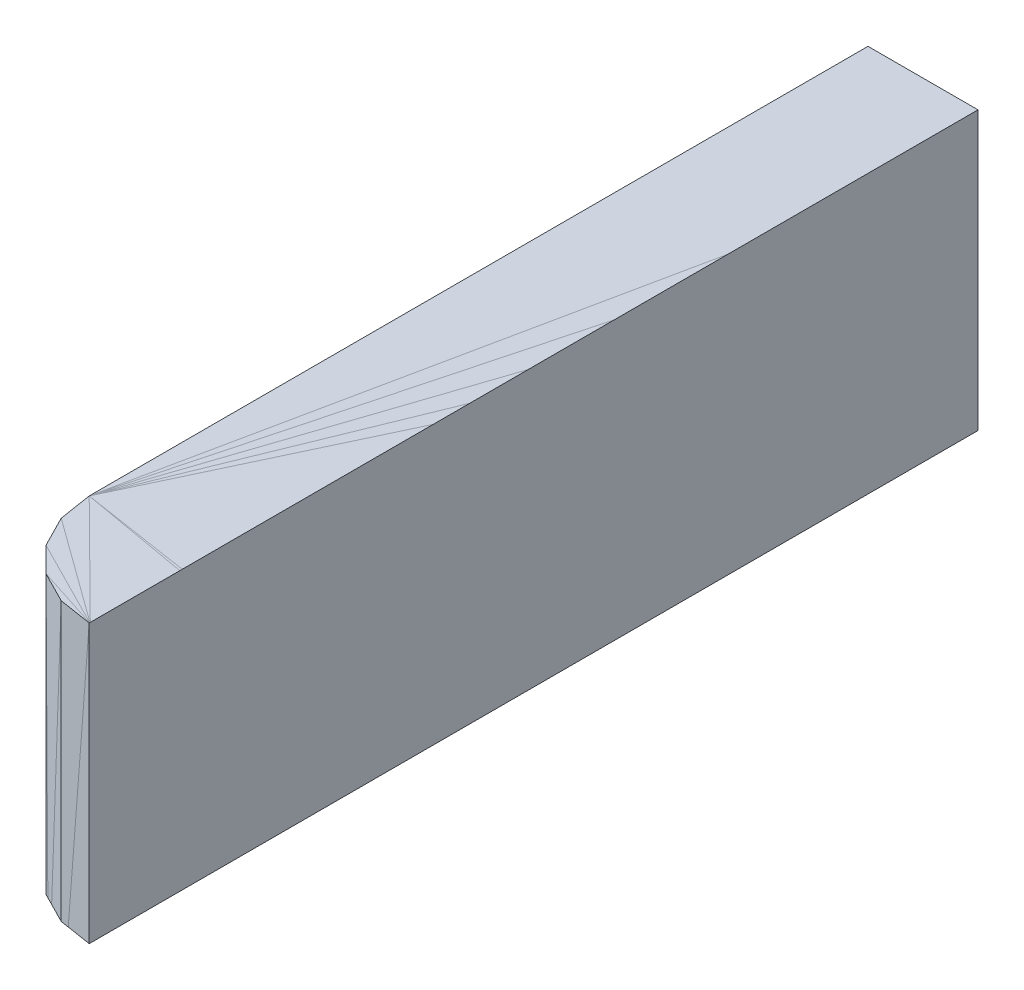
ISO-10303-21;
HEADER;
FILE_DESCRIPTION(('STEP AP214'),'2;1');
FILE_NAME('part.step','',(''),(''),'','','');
FILE_SCHEMA(('AUTOMOTIVE_DESIGN { 1 0 10303 214 1 1 1 1 }'));
ENDSEC;
DATA;
#1=APPLICATION_CONTEXT('core data for automotive mechanical design processes');
#2=APPLICATION_PROTOCOL_DEFINITION('international standard','automotive_design',2000,#1);
#3=PRODUCT_CONTEXT('',#1,'mechanical');
#4=PRODUCT('Part','Part','',(#3));
#5=PRODUCT_RELATED_PRODUCT_CATEGORY('part','',(#4));
#6=PRODUCT_DEFINITION_FORMATION('','',#4);
#7=PRODUCT_DEFINITION_CONTEXT('part definition',#1,'design');
#8=PRODUCT_DEFINITION('design','',#6,#7);
#9=PRODUCT_DEFINITION_SHAPE('','',#8);
#10=(LENGTH_UNIT() NAMED_UNIT(*) SI_UNIT(.MILLI.,.METRE.));
#11=(NAMED_UNIT(*) PLANE_ANGLE_UNIT() SI_UNIT($,.RADIAN.));
#12=(NAMED_UNIT(*) SI_UNIT($,.STERADIAN.) SOLID_ANGLE_UNIT());
#13=UNCERTAINTY_MEASURE_WITH_UNIT(LENGTH_MEASURE(1.E-05),#10,'distance_accuracy_value','');
#14=(GEOMETRIC_REPRESENTATION_CONTEXT(3) GLOBAL_UNCERTAINTY_ASSIGNED_CONTEXT((#13)) GLOBAL_UNIT_ASSIGNED_CONTEXT((#10,
#11,#12)) REPRESENTATION_CONTEXT('',''));
#15=CARTESIAN_POINT('',(0.,0.,0.));
#16=DIRECTION('',(0.,0.,1.));
#17=DIRECTION('',(1.,0.,0.));
#18=AXIS2_PLACEMENT_3D('',#15,#16,#17);
#19=CARTESIAN_POINT('',(-47.7126354140296,15.6714378666219,30.8928780829092));
#20=DIRECTION('',(0.,1.,0.));
#21=DIRECTION('',(0.,0.,1.));
#22=AXIS2_PLACEMENT_3D('',#19,#20,#21);
#23=PLANE('',#22);
#24=DIRECTION('',(0.,0.,-1.));
#25=VECTOR('',#24,1.);
#26=CARTESIAN_POINT('',(-104.452634395386,15.6714378666219,6.89287787429294));
#27=LINE('',#26,#25);
#28=CARTESIAN_POINT('',(-104.452634395386,15.6714378666219,14.3599334465165));
#29=VERTEX_POINT('',#28);
#30=CARTESIAN_POINT('',(-104.452634395386,15.6714378666219,6.89287787429294));
#31=VERTEX_POINT('',#30);
#32=EDGE_CURVE('E199',#29,#31,#27,.T.);
#33=ORIENTED_EDGE('',*,*,#32,.T.);
#34=DIRECTION('',(1.,0.,0.));
#35=VECTOR('',#34,1.);
#36=CARTESIAN_POINT('',(-64.4526352894559,15.6714378666219,6.89287787429294));
#37=LINE('',#36,#35);
#38=CARTESIAN_POINT('',(-101.482233197714,15.6714378666219,6.89287787429294));
#39=VERTEX_POINT('',#38);
#40=EDGE_CURVE('E194',#31,#39,#37,.T.);
#41=ORIENTED_EDGE('',*,*,#40,.T.);
#42=DIRECTION('',(0.,0.,1.));
#43=VECTOR('',#42,1.);
#44=CARTESIAN_POINT('',(-101.482233197714,15.6714378666219,30.8928780829092));
#45=LINE('',#44,#43);
#46=CARTESIAN_POINT('',(-101.482233197714,15.6714378666219,30.8928780829092));
#47=VERTEX_POINT('',#46);
#48=EDGE_CURVE('E42',#39,#47,#45,.T.);
#49=ORIENTED_EDGE('',*,*,#48,.T.);
#50=DIRECTION('',(-0.987710732386167,0.,-0.15629302329017));
#51=VECTOR('',#50,1.);
#52=CARTESIAN_POINT('',(-69.0621112786331,15.6714378666219,36.0229619263113));
#53=LINE('',#52,#51);
#54=CARTESIAN_POINT('',(-102.154415055144,15.6714378666219,30.7865136066979));
#55=VERTEX_POINT('',#54);
#56=EDGE_CURVE('E223',#47,#55,#53,.T.);
#57=ORIENTED_EDGE('',*,*,#56,.T.);
#58=CARTESIAN_POINT('',(-102.379633278872,15.6714378666219,30.7508756046673));
#59=VERTEX_POINT('',#58);
#60=EDGE_CURVE('E376',#55,#59,#53,.T.);
#61=ORIENTED_EDGE('',*,*,#60,.T.);
#62=DIRECTION('',(-0.890999816877181,0.,-0.454003663338558));
#63=VECTOR('',#62,1.);
#64=CARTESIAN_POINT('',(-81.9210925482771,15.6714378666219,41.1754034915586));
#65=LINE('',#64,#63);
#66=CARTESIAN_POINT('',(-102.906731030376,15.6714378666219,30.4822960768296));
#67=VERTEX_POINT('',#66);
#68=EDGE_CURVE('E379',#59,#67,#65,.T.);
#69=ORIENTED_EDGE('',*,*,#68,.T.);
#70=CARTESIAN_POINT('',(-103.116042395981,15.6714378666219,30.3756426798131));
#71=VERTEX_POINT('',#70);
#72=EDGE_CURVE('E383',#67,#71,#65,.T.);
#73=ORIENTED_EDGE('',*,*,#72,.T.);
#74=CARTESIAN_POINT('',(-103.217633606221,15.6714378666219,30.3238772427221));
#75=VERTEX_POINT('',#74);
#76=EDGE_CURVE('E380',#71,#75,#65,.T.);
#77=ORIENTED_EDGE('',*,*,#76,.T.);
#78=DIRECTION('',(-0.707106781186548,0.,-0.707106781186548));
#79=VECTOR('',#78,1.);
#80=CARTESIAN_POINT('',(-95.5506341320529,15.6714378666219,37.9908767168899));
#81=LINE('',#80,#79);
#82=CARTESIAN_POINT('',(-103.384136973863,15.6714378666219,30.1573738750801));
#83=VERTEX_POINT('',#82);
#84=EDGE_CURVE('E306',#75,#83,#81,.T.);
#85=ORIENTED_EDGE('',*,*,#84,.T.);
#86=CARTESIAN_POINT('',(-103.883633555199,15.6714378666219,29.6578772937437));
#87=VERTEX_POINT('',#86);
#88=EDGE_CURVE('E311',#83,#87,#81,.T.);
#89=ORIENTED_EDGE('',*,*,#88,.T.);
#90=DIRECTION('',(0.45400587416511,0.,0.890998690360191));
#91=VECTOR('',#90,1.);
#92=CARTESIAN_POINT('',(-104.964930648465,15.6714378666219,27.5358039166048));
#93=LINE('',#92,#91);
#94=CARTESIAN_POINT('',(-103.9913321221,15.6714378666219,29.4465171062155));
#95=VERTEX_POINT('',#94);
#96=EDGE_CURVE('E222',#95,#87,#93,.T.);
#97=ORIENTED_EDGE('',*,*,#96,.F.);
#98=CARTESIAN_POINT('',(-104.234263096914,15.6714378666219,28.969758560293));
#99=VERTEX_POINT('',#98);
#100=EDGE_CURVE('E220',#99,#95,#93,.T.);
#101=ORIENTED_EDGE('',*,*,#100,.F.);
#102=DIRECTION('',(-0.454013967067134,0.,-0.890994566598452));
#103=VECTOR('',#102,1.);
#104=CARTESIAN_POINT('',(-104.964756170414,15.6714378666219,27.5361785239101));
#105=LINE('',#104,#103);
#106=CARTESIAN_POINT('',(-104.31063750508,15.6714378666219,28.8198751037498));
#107=VERTEX_POINT('',#106);
#108=EDGE_CURVE('E384',#99,#107,#105,.T.);
#109=ORIENTED_EDGE('',*,*,#108,.T.);
#110=DIRECTION('',(-0.156287339702144,0.,-0.987711631727007));
#111=VECTOR('',#110,1.);
#112=CARTESIAN_POINT('',(-106.721877510095,15.6714378666219,13.5812140299971));
#113=LINE('',#112,#111);
#114=CARTESIAN_POINT('',(-104.347030159967,15.6714378666219,28.5898791961496));
#115=VERTEX_POINT('',#114);
#116=EDGE_CURVE('E387',#107,#115,#113,.T.);
#117=ORIENTED_EDGE('',*,*,#116,.T.);
#118=CARTESIAN_POINT('',(-104.452634395386,15.6714378666219,27.9224768852373));
#119=VERTEX_POINT('',#118);
#120=EDGE_CURVE('E388',#115,#119,#113,.T.);
#121=ORIENTED_EDGE('',*,*,#120,.T.);
#122=CARTESIAN_POINT('',(-104.452634395386,15.6714378666219,27.73083708208));
#123=VERTEX_POINT('',#122);
#124=EDGE_CURVE('E391',#119,#123,#27,.T.);
#125=ORIENTED_EDGE('',*,*,#124,.T.);
#126=CARTESIAN_POINT('',(-104.452634395386,15.6714378666219,26.7873686437674));
#127=VERTEX_POINT('',#126);
#128=EDGE_CURVE('E454',#123,#127,#27,.T.);
#129=ORIENTED_EDGE('',*,*,#128,.T.);
#130=CARTESIAN_POINT('',(-104.452634395386,15.6714378666219,25.9438046093534));
#131=VERTEX_POINT('',#130);
#132=EDGE_CURVE('E449',#127,#131,#27,.T.);
#133=ORIENTED_EDGE('',*,*,#132,.T.);
#134=CARTESIAN_POINT('',(-104.452634395386,15.6714378666219,25.222503525982));
#135=VERTEX_POINT('',#134);
#136=EDGE_CURVE('E444',#131,#135,#27,.T.);
#137=ORIENTED_EDGE('',*,*,#136,.T.);
#138=CARTESIAN_POINT('',(-104.452634395386,15.6714378666219,24.6333797308494));
#139=VERTEX_POINT('',#138);
#140=EDGE_CURVE('E439',#135,#139,#27,.T.);
#141=ORIENTED_EDGE('',*,*,#140,.T.);
#142=CARTESIAN_POINT('',(-104.452634395386,15.6714378666219,16.6332785925707));
#143=VERTEX_POINT('',#142);
#144=EDGE_CURVE('E434',#139,#143,#27,.T.);
#145=ORIENTED_EDGE('',*,*,#144,.T.);
#146=CARTESIAN_POINT('',(-104.452634395386,15.6714378666219,15.4341724953372));
#147=VERTEX_POINT('',#146);
#148=EDGE_CURVE('E829',#143,#147,#27,.T.);
#149=ORIENTED_EDGE('',*,*,#148,.T.);
#150=EDGE_CURVE('E394',#147,#29,#27,.T.);
#151=ORIENTED_EDGE('',*,*,#150,.T.);
#152=EDGE_LOOP('',(#33,#41,#49,#57,#61,#69,#73,#77,#85,#89,#97,#101,#109,#117,#121,#125,#129,
#133,#137,#141,#145,#149,#151));
#153=FACE_BOUND('',#152,.T.);
#154=ADVANCED_FACE('F39',(#153),#23,.F.);
#155=CARTESIAN_POINT('',(-101.482233197714,15.6714378666219,30.8928780829092));
#156=DIRECTION('',(1.,0.,0.));
#157=DIRECTION('',(0.,0.,-1.));
#158=AXIS2_PLACEMENT_3D('',#155,#156,#157);
#159=PLANE('',#158);
#160=DIRECTION('',(0.,1.,0.));
#161=VECTOR('',#160,1.);
#162=CARTESIAN_POINT('',(-101.482233197714,13.152210302287,30.8928780829092));
#163=LINE('',#162,#161);
#164=CARTESIAN_POINT('',(-101.482233197714,23.1714400272903,30.8928780829092));
#165=VERTEX_POINT('',#164);
#166=EDGE_CURVE('E11',#47,#165,#163,.T.);
#167=ORIENTED_EDGE('',*,*,#166,.F.);
#168=ORIENTED_EDGE('',*,*,#48,.F.);
#169=DIRECTION('',(0.,1.,0.));
#170=VECTOR('',#169,1.);
#171=CARTESIAN_POINT('',(-101.482233197714,15.6714378666219,6.89287787429294));
#172=LINE('',#171,#170);
#173=CARTESIAN_POINT('',(-101.482233197714,23.1714400272903,6.89287787429294));
#174=VERTEX_POINT('',#173);
#175=EDGE_CURVE('E211',#39,#174,#172,.T.);
#176=ORIENTED_EDGE('',*,*,#175,.T.);
#177=DIRECTION('',(0.,0.,1.));
#178=VECTOR('',#177,1.);
#179=CARTESIAN_POINT('',(-101.482233197714,23.1714400272903,6.89287787429294));
#180=LINE('',#179,#178);
#181=CARTESIAN_POINT('',(-101.482233197714,23.1714400272903,13.6415272076272));
#182=VERTEX_POINT('',#181);
#183=EDGE_CURVE('E292',#174,#182,#180,.T.);
#184=ORIENTED_EDGE('',*,*,#183,.T.);
#185=DIRECTION('',(0.,0.,-1.));
#186=VECTOR('',#185,1.);
#187=CARTESIAN_POINT('',(-101.482233197714,23.1714400272903,6.89287787429294));
#188=LINE('',#187,#186);
#189=CARTESIAN_POINT('',(-101.482233197714,23.1714400272903,16.7084328827989));
#190=VERTEX_POINT('',#189);
#191=EDGE_CURVE('E289',#190,#182,#188,.T.);
#192=ORIENTED_EDGE('',*,*,#191,.F.);
#193=DIRECTION('',(0.,0.,1.));
#194=VECTOR('',#193,1.);
#195=CARTESIAN_POINT('',(-101.482233197714,23.1714400272903,6.89287787429294));
#196=LINE('',#195,#194);
#197=CARTESIAN_POINT('',(-101.482233197714,23.1714400272903,19.038814499266));
#198=VERTEX_POINT('',#197);
#199=EDGE_CURVE('E295',#190,#198,#196,.T.);
#200=ORIENTED_EDGE('',*,*,#199,.T.);
#201=DIRECTION('',(0.,0.,1.));
#202=VECTOR('',#201,1.);
#203=CARTESIAN_POINT('',(-101.482233197714,23.1714400272903,6.89287787429294));
#204=LINE('',#203,#202);
#205=CARTESIAN_POINT('',(-101.482233197714,23.1714400272903,20.6171264776098));
#206=VERTEX_POINT('',#205);
#207=EDGE_CURVE('E302',#198,#206,#204,.T.);
#208=ORIENTED_EDGE('',*,*,#207,.T.);
#209=DIRECTION('',(0.,0.,-1.));
#210=VECTOR('',#209,1.);
#211=CARTESIAN_POINT('',(-101.482233197714,23.1714400272903,6.89287787429294));
#212=LINE('',#211,#210);
#213=CARTESIAN_POINT('',(-101.482233197714,23.1714400272903,21.6038587924092));
#214=VERTEX_POINT('',#213);
#215=EDGE_CURVE('E286',#214,#206,#212,.T.);
#216=ORIENTED_EDGE('',*,*,#215,.F.);
#217=DIRECTION('',(0.,0.,-1.));
#218=VECTOR('',#217,1.);
#219=CARTESIAN_POINT('',(-101.482233197714,23.1714400272903,6.89287787429294));
#220=LINE('',#219,#218);
#221=CARTESIAN_POINT('',(-101.482233197714,23.1714400272903,28.3805314626491));
#222=VERTEX_POINT('',#221);
#223=EDGE_CURVE('E283',#222,#214,#220,.T.);
#224=ORIENTED_EDGE('',*,*,#223,.F.);
#225=DIRECTION('',(0.,0.,1.));
#226=VECTOR('',#225,1.);
#227=CARTESIAN_POINT('',(-101.482233197714,23.1714400272903,6.89287787429294));
#228=LINE('',#227,#226);
#229=CARTESIAN_POINT('',(-101.482233197714,23.1714400272903,28.4456326620037));
#230=VERTEX_POINT('',#229);
#231=EDGE_CURVE('E205',#222,#230,#228,.T.);
#232=ORIENTED_EDGE('',*,*,#231,.T.);
#233=DIRECTION('',(0.,0.,-1.));
#234=VECTOR('',#233,1.);
#235=CARTESIAN_POINT('',(-101.482233197714,23.1714400272903,6.89287787429294));
#236=LINE('',#235,#234);
#237=CARTESIAN_POINT('',(-101.482233197714,23.1714400272903,30.8635726542703));
#238=VERTEX_POINT('',#237);
#239=EDGE_CURVE('E276',#238,#230,#236,.T.);
#240=ORIENTED_EDGE('',*,*,#239,.F.);
#241=DIRECTION('',(0.,0.,-1.));
#242=VECTOR('',#241,1.);
#243=CARTESIAN_POINT('',(-101.482233197714,23.1714400272903,6.89287787429294));
#244=LINE('',#243,#242);
#245=CARTESIAN_POINT('',(-101.482233197714,23.1714400272903,30.8714100891431));
#246=VERTEX_POINT('',#245);
#247=EDGE_CURVE('E279',#246,#238,#244,.T.);
#248=ORIENTED_EDGE('',*,*,#247,.F.);
#249=DIRECTION('',(0.,0.,1.));
#250=VECTOR('',#249,1.);
#251=CARTESIAN_POINT('',(-101.482233197714,23.1714400272903,6.89287787429294));
#252=LINE('',#251,#250);
#253=CARTESIAN_POINT('',(-101.482233197714,23.1714400272903,30.877841931363));
#254=VERTEX_POINT('',#253);
#255=EDGE_CURVE('E316',#246,#254,#252,.T.);
#256=ORIENTED_EDGE('',*,*,#255,.T.);
#257=DIRECTION('',(0.,0.,1.));
#258=VECTOR('',#257,1.);
#259=CARTESIAN_POINT('',(-101.482233197714,23.1714400272903,6.89287787429294));
#260=LINE('',#259,#258);
#261=CARTESIAN_POINT('',(-101.482233197714,23.1714400272903,30.8833364489394));
#262=VERTEX_POINT('',#261);
#263=EDGE_CURVE('E312',#254,#262,#260,.T.);
#264=ORIENTED_EDGE('',*,*,#263,.T.);
#265=DIRECTION('',(0.,0.,1.));
#266=VECTOR('',#265,1.);
#267=CARTESIAN_POINT('',(-101.482233197714,23.1714400272903,6.89287787429294));
#268=LINE('',#267,#266);
#269=CARTESIAN_POINT('',(-101.482233197714,23.1714400272903,30.8883441887462));
#270=VERTEX_POINT('',#269);
#271=EDGE_CURVE('E307',#262,#270,#268,.T.);
#272=ORIENTED_EDGE('',*,*,#271,.T.);
#273=DIRECTION('',(0.,0.,1.));
#274=VECTOR('',#273,1.);
#275=CARTESIAN_POINT('',(-101.482233197714,23.1714400272903,6.89287787429294));
#276=LINE('',#275,#274);
#277=EDGE_CURVE('E299',#270,#165,#276,.T.);
#278=ORIENTED_EDGE('',*,*,#277,.T.);
#279=EDGE_LOOP('',(#167,#168,#176,#184,#192,#200,#208,#216,#224,#232,#240,#248,#256,#264,#272,#278));
#280=FACE_BOUND('',#279,.T.);
#281=ADVANCED_FACE('F209',(#280),#159,.T.);
#282=CARTESIAN_POINT('',(-64.4526352894559,23.1714400272903,6.89287787429294));
#283=DIRECTION('',(0.,-1.,0.));
#284=DIRECTION('',(0.,0.,-1.));
#285=AXIS2_PLACEMENT_3D('',#282,#283,#284);
#286=PLANE('',#285);
#287=DIRECTION('',(-0.203639082718757,0.,0.979046027513244));
#288=VECTOR('',#287,1.);
#289=CARTESIAN_POINT('',(-101.381635458495,23.1714400272903,13.1578783144732));
#290=LINE('',#289,#288);
#291=CARTESIAN_POINT('',(-104.452634395386,23.1714400272903,27.9224768852373));
#292=VERTEX_POINT('',#291);
#293=EDGE_CURVE('E244',#182,#292,#290,.T.);
#294=ORIENTED_EDGE('',*,*,#293,.F.);
#295=ORIENTED_EDGE('',*,*,#183,.F.);
#296=DIRECTION('',(1.,0.,0.));
#297=VECTOR('',#296,1.);
#298=CARTESIAN_POINT('',(-104.452634395386,23.1714400272903,6.89287787429294));
#299=LINE('',#298,#297);
#300=CARTESIAN_POINT('',(-104.452634395386,23.1714400272903,6.89287787429294));
#301=VERTEX_POINT('',#300);
#302=EDGE_CURVE('E217',#301,#174,#299,.T.);
#303=ORIENTED_EDGE('',*,*,#302,.F.);
#304=DIRECTION('',(0.,0.,-1.));
#305=VECTOR('',#304,1.);
#306=CARTESIAN_POINT('',(-104.452634395386,23.1714400272903,27.9224768852373));
#307=LINE('',#306,#305);
#308=EDGE_CURVE('E239',#292,#301,#307,.T.);
#309=ORIENTED_EDGE('',*,*,#308,.F.);
#310=EDGE_LOOP('',(#294,#295,#303,#309));
#311=FACE_BOUND('',#310,.T.);
#312=ADVANCED_FACE('F430',(#311),#286,.F.);
#313=CARTESIAN_POINT('',(-81.9210925482771,53.171439356738,41.1754034915586));
#314=DIRECTION('',(-0.454003663338558,0.,0.890999816877181));
#315=DIRECTION('',(0.890999816877181,0.,0.454003663338558));
#316=AXIS2_PLACEMENT_3D('',#313,#314,#315);
#317=PLANE('',#316);
#318=ORIENTED_EDGE('',*,*,#68,.F.);
#319=DIRECTION('',(0.,1.,0.));
#320=VECTOR('',#319,1.);
#321=CARTESIAN_POINT('',(-102.379633278872,13.1585209440526,30.7508756046673));
#322=LINE('',#321,#320);
#323=CARTESIAN_POINT('',(-102.379633278872,23.1714400272903,30.7508756046673));
#324=VERTEX_POINT('',#323);
#325=EDGE_CURVE('E229',#59,#324,#322,.T.);
#326=ORIENTED_EDGE('',*,*,#325,.T.);
#327=DIRECTION('',(-0.0700620677030488,-0.996903624905131,-0.0356997103655329));
#328=VECTOR('',#327,1.);
#329=CARTESIAN_POINT('',(-102.379633278872,23.1714400272903,30.7508756046673));
#330=LINE('',#329,#328);
#331=EDGE_CURVE('E230',#324,#67,#330,.T.);
#332=ORIENTED_EDGE('',*,*,#331,.T.);
#333=EDGE_LOOP('',(#318,#326,#332));
#334=FACE_BOUND('',#333,.T.);
#335=ADVANCED_FACE('F507',(#334),#317,.T.);
#336=CARTESIAN_POINT('',(-104.964937455433,53.1714300936597,27.5358073850762));
#337=DIRECTION('',(0.890998690360172,2.03725540127744E-07,-0.4540058741651));
#338=DIRECTION('',(-0.45400587416511,0.,-0.890998690360191));
#339=AXIS2_PLACEMENT_3D('',#336,#337,#338);
#340=PLANE('',#339);
#341=DIRECTION('',(0.0101806909743878,-0.999748556339114,0.0199794301505622));
#342=VECTOR('',#341,1.);
#343=CARTESIAN_POINT('',(-104.31063750508,23.1714400272903,28.8198751037498));
#344=LINE('',#343,#342);
#345=CARTESIAN_POINT('',(-104.31063750508,23.1714400272903,28.8198751037498));
#346=VERTEX_POINT('',#345);
#347=EDGE_CURVE('E234',#346,#99,#344,.T.);
#348=ORIENTED_EDGE('',*,*,#347,.T.);
#349=ORIENTED_EDGE('',*,*,#100,.T.);
#350=DIRECTION('',(-0.0423880763928045,0.995632023380909,-0.0831872886813569));
#351=VECTOR('',#350,1.);
#352=CARTESIAN_POINT('',(-103.883633555199,13.1417608629999,29.6578772937437));
#353=LINE('',#352,#351);
#354=EDGE_CURVE('E237',#95,#346,#353,.T.);
#355=ORIENTED_EDGE('',*,*,#354,.T.);
#356=EDGE_LOOP('',(#348,#349,#355));
#357=FACE_BOUND('',#356,.T.);
#358=ADVANCED_FACE('F416',(#357),#340,.F.);
#359=CARTESIAN_POINT('',(-104.964756170414,53.171439356738,27.5361785239101));
#360=DIRECTION('',(-0.890994566598452,0.,0.454013967067134));
#361=DIRECTION('',(0.454013967067134,0.,0.890994566598452));
#362=AXIS2_PLACEMENT_3D('',#359,#360,#361);
#363=PLANE('',#362);
#364=ORIENTED_EDGE('',*,*,#108,.F.);
#365=ORIENTED_EDGE('',*,*,#347,.F.);
#366=DIRECTION('',(0.,1.,0.));
#367=VECTOR('',#366,1.);
#368=CARTESIAN_POINT('',(-104.31063750508,13.0868351828393,28.8198751037498));
#369=LINE('',#368,#367);
#370=EDGE_CURVE('E238',#107,#346,#369,.T.);
#371=ORIENTED_EDGE('',*,*,#370,.F.);
#372=EDGE_LOOP('',(#364,#365,#371));
#373=FACE_BOUND('',#372,.T.);
#374=ADVANCED_FACE('F419',(#373),#363,.T.);
#375=CARTESIAN_POINT('',(-106.721877510095,53.171439356738,13.5812140299971));
#376=DIRECTION('',(-0.987711631727007,0.,0.156287339702144));
#377=DIRECTION('',(0.156287339702144,0.,0.987711631727007));
#378=AXIS2_PLACEMENT_3D('',#375,#376,#377);
#379=PLANE('',#378);
#380=ORIENTED_EDGE('',*,*,#120,.F.);
#381=DIRECTION('',(-0.014023760686522,0.99596607116877,-0.0886279821323474));
#382=VECTOR('',#381,1.);
#383=CARTESIAN_POINT('',(-104.31063750508,13.0868351828393,28.8198751037498));
#384=LINE('',#383,#382);
#385=EDGE_CURVE('E350',#115,#292,#384,.T.);
#386=ORIENTED_EDGE('',*,*,#385,.T.);
#387=DIRECTION('',(0.,1.,0.));
#388=VECTOR('',#387,1.);
#389=CARTESIAN_POINT('',(-104.452634395386,12.9680617522535,27.9224768852373));
#390=LINE('',#389,#388);
#391=EDGE_CURVE('E353',#119,#292,#390,.T.);
#392=ORIENTED_EDGE('',*,*,#391,.F.);
#393=EDGE_LOOP('',(#380,#386,#392));
#394=FACE_BOUND('',#393,.T.);
#395=ADVANCED_FACE('F601',(#394),#379,.T.);
#396=CARTESIAN_POINT('',(-104.452634395386,53.171439356738,6.89287787429294));
#397=DIRECTION('',(-1.,0.,0.));
#398=DIRECTION('',(0.,0.,1.));
#399=AXIS2_PLACEMENT_3D('',#396,#397,#398);
#400=PLANE('',#399);
#401=ORIENTED_EDGE('',*,*,#124,.F.);
#402=ORIENTED_EDGE('',*,*,#391,.T.);
#403=DIRECTION('',(0.,0.999673708275664,0.025543628997893));
#404=VECTOR('',#403,1.);
#405=CARTESIAN_POINT('',(-104.452634395386,12.9334389042196,27.6608758246084));
#406=LINE('',#405,#404);
#407=EDGE_CURVE('E356',#123,#292,#406,.T.);
#408=ORIENTED_EDGE('',*,*,#407,.F.);
#409=EDGE_LOOP('',(#401,#402,#408));
#410=FACE_BOUND('',#409,.T.);
#411=ADVANCED_FACE('F458',(#410),#400,.T.);
#412=ORIENTED_EDGE('',*,*,#128,.F.);
#413=ORIENTED_EDGE('',*,*,#407,.T.);
#414=DIRECTION('',(0.,0.988740010563365,0.149643548177518));
#415=VECTOR('',#414,1.);
#416=CARTESIAN_POINT('',(-104.452634395386,12.6354417573747,26.3278775488516));
#417=LINE('',#416,#415);
#418=EDGE_CURVE('E359',#127,#292,#417,.T.);
#419=ORIENTED_EDGE('',*,*,#418,.F.);
#420=EDGE_LOOP('',(#412,#413,#419));
#421=FACE_BOUND('',#420,.T.);
#422=ADVANCED_FACE('F453',(#421),#400,.T.);
#423=ORIENTED_EDGE('',*,*,#132,.F.);
#424=ORIENTED_EDGE('',*,*,#418,.T.);
#425=DIRECTION('',(0.,0.966916099341933,0.255094603693182));
#426=VECTOR('',#425,1.);
#427=CARTESIAN_POINT('',(-104.452634395386,12.2224374484357,25.0338793372293));
#428=LINE('',#427,#426);
#429=EDGE_CURVE('E362',#131,#292,#428,.T.);
#430=ORIENTED_EDGE('',*,*,#429,.F.);
#431=EDGE_LOOP('',(#423,#424,#430));
#432=FACE_BOUND('',#431,.T.);
#433=ADVANCED_FACE('F448',(#432),#400,.T.);
#434=ORIENTED_EDGE('',*,*,#136,.F.);
#435=ORIENTED_EDGE('',*,*,#429,.T.);
#436=DIRECTION('',(0.,0.940888508088634,0.338716423201983));
#437=VECTOR('',#436,1.);
#438=CARTESIAN_POINT('',(-104.452634395386,11.6974397372541,23.791878727593));
#439=LINE('',#438,#437);
#440=EDGE_CURVE('E365',#135,#292,#439,.T.);
#441=ORIENTED_EDGE('',*,*,#440,.F.);
#442=EDGE_LOOP('',(#434,#435,#441));
#443=FACE_BOUND('',#442,.T.);
#444=ADVANCED_FACE('F443',(#443),#400,.T.);
#445=CARTESIAN_POINT('',(-64.4526352894559,23.1714400272903,6.89287787429294));
#446=DIRECTION('',(0.,1.,0.));
#447=DIRECTION('',(0.,0.,1.));
#448=AXIS2_PLACEMENT_3D('',#445,#446,#447);
#449=PLANE('',#448);
#450=DIRECTION('',(-0.256051880447548,0.,0.966663040836503));
#451=VECTOR('',#450,1.);
#452=CARTESIAN_POINT('',(-100.717635990407,23.1714400272903,13.8218777825614));
#453=LINE('',#452,#451);
#454=EDGE_CURVE('E248',#190,#292,#453,.T.);
#455=ORIENTED_EDGE('',*,*,#454,.F.);
#456=ORIENTED_EDGE('',*,*,#191,.T.);
#457=ORIENTED_EDGE('',*,*,#293,.T.);
#458=EDGE_LOOP('',(#455,#456,#457));
#459=FACE_BOUND('',#458,.T.);
#460=ADVANCED_FACE('F463',(#459),#449,.T.);
#461=CARTESIAN_POINT('',(-69.0621112786331,53.171439356738,36.0229619263113));
#462=DIRECTION('',(-0.15629302329017,0.,0.987710732386167));
#463=DIRECTION('',(0.987710732386167,0.,0.15629302329017));
#464=AXIS2_PLACEMENT_3D('',#461,#462,#463);
#465=PLANE('',#464);
#466=ORIENTED_EDGE('',*,*,#60,.F.);
#467=DIRECTION('',(-0.0892575185056616,-0.995908434970085,-0.0141238998030589));
#468=VECTOR('',#467,1.);
#469=CARTESIAN_POINT('',(-101.482233197714,23.1714400272903,30.8928780829092));
#470=LINE('',#469,#468);
#471=EDGE_CURVE('E47',#165,#55,#470,.T.);
#472=ORIENTED_EDGE('',*,*,#471,.F.);
#473=DIRECTION('',(0.987710732386167,0.,0.15629302329017));
#474=VECTOR('',#473,1.);
#475=CARTESIAN_POINT('',(-102.379633278872,23.1714400272903,30.7508756046673));
#476=LINE('',#475,#474);
#477=EDGE_CURVE('E245',#324,#165,#476,.T.);
#478=ORIENTED_EDGE('',*,*,#477,.F.);
#479=ORIENTED_EDGE('',*,*,#325,.F.);
#480=EDGE_LOOP('',(#466,#472,#478,#479));
#481=FACE_BOUND('',#480,.T.);
#482=ADVANCED_FACE('F500',(#481),#465,.T.);
#483=CARTESIAN_POINT('',(-64.4526352894559,23.1714400272903,6.89287787429294));
#484=DIRECTION('',(0.,-1.,0.));
#485=DIRECTION('',(0.,0.,-1.));
#486=AXIS2_PLACEMENT_3D('',#483,#484,#485);
#487=PLANE('',#486);
#488=ORIENTED_EDGE('',*,*,#199,.F.);
#489=ORIENTED_EDGE('',*,*,#454,.T.);
#490=DIRECTION('',(-0.317109690344198,0.,0.948388867653879));
#491=VECTOR('',#490,1.);
#492=CARTESIAN_POINT('',(-99.8806377661481,23.1714400272903,14.2488780071517));
#493=LINE('',#492,#491);
#494=EDGE_CURVE('E249',#198,#292,#493,.T.);
#495=ORIENTED_EDGE('',*,*,#494,.F.);
#496=EDGE_LOOP('',(#488,#489,#495));
#497=FACE_BOUND('',#496,.T.);
#498=ADVANCED_FACE('F467',(#497),#487,.F.);
#499=ORIENTED_EDGE('',*,*,#76,.F.);
#500=DIRECTION('',(0.0135439276024447,-0.999884460676113,0.00690125521464872));
#501=VECTOR('',#500,1.);
#502=CARTESIAN_POINT('',(-103.217633606221,23.1714400272903,30.3238772427221));
#503=LINE('',#502,#501);
#504=CARTESIAN_POINT('',(-103.217633606221,23.1714400272903,30.3238772427221));
#505=VERTEX_POINT('',#504);
#506=EDGE_CURVE('E226',#505,#71,#503,.T.);
#507=ORIENTED_EDGE('',*,*,#506,.F.);
#508=DIRECTION('',(0.,1.,0.));
#509=VECTOR('',#508,1.);
#510=CARTESIAN_POINT('',(-103.217633606221,13.171369470292,30.3238772427221));
#511=LINE('',#510,#509);
#512=EDGE_CURVE('E253',#75,#505,#511,.T.);
#513=ORIENTED_EDGE('',*,*,#512,.F.);
#514=EDGE_LOOP('',(#499,#507,#513));
#515=FACE_BOUND('',#514,.T.);
#516=ADVANCED_FACE('F512',(#515),#317,.T.);
#517=CARTESIAN_POINT('',(-64.4526352894559,23.1714400272903,6.89287787429294));
#518=DIRECTION('',(0.,-1.,0.));
#519=DIRECTION('',(0.,0.,-1.));
#520=AXIS2_PLACEMENT_3D('',#517,#518,#519);
#521=PLANE('',#520);
#522=ORIENTED_EDGE('',*,*,#277,.F.);
#523=DIRECTION('',(0.988469651789089,0.,0.151419112043218));
#524=VECTOR('',#523,1.);
#525=CARTESIAN_POINT('',(-102.379633278872,23.1714400272903,30.7508756046673));
#526=LINE('',#525,#524);
#527=EDGE_CURVE('E257',#324,#270,#526,.T.);
#528=ORIENTED_EDGE('',*,*,#527,.F.);
#529=ORIENTED_EDGE('',*,*,#477,.T.);
#530=EDGE_LOOP('',(#522,#528,#529));
#531=FACE_BOUND('',#530,.T.);
#532=ADVANCED_FACE('F496',(#531),#521,.F.);
#533=ORIENTED_EDGE('',*,*,#72,.F.);
#534=ORIENTED_EDGE('',*,*,#331,.F.);
#535=DIRECTION('',(0.890999699188411,0.,0.454003894307263));
#536=VECTOR('',#535,1.);
#537=CARTESIAN_POINT('',(-103.217633606221,23.1714400272903,30.3238772427221));
#538=LINE('',#537,#536);
#539=EDGE_CURVE('E254',#505,#324,#538,.T.);
#540=ORIENTED_EDGE('',*,*,#539,.F.);
#541=ORIENTED_EDGE('',*,*,#506,.T.);
#542=EDGE_LOOP('',(#533,#534,#540,#541));
#543=FACE_BOUND('',#542,.T.);
#544=ADVANCED_FACE('F510',(#543),#317,.T.);
#545=CARTESIAN_POINT('',(-64.4526352894559,23.1714400272903,6.89287787429294));
#546=DIRECTION('',(0.,-1.,0.));
#547=DIRECTION('',(0.,0.,-1.));
#548=AXIS2_PLACEMENT_3D('',#545,#546,#547);
#549=PLANE('',#548);
#550=ORIENTED_EDGE('',*,*,#207,.F.);
#551=ORIENTED_EDGE('',*,*,#494,.T.);
#552=DIRECTION('',(-0.376660299484678,0.,0.926351455330056));
#553=VECTOR('',#552,1.);
#554=CARTESIAN_POINT('',(-98.9526344251885,23.1714400272903,14.3958774966677));
#555=LINE('',#554,#553);
#556=EDGE_CURVE('E258',#206,#292,#555,.T.);
#557=ORIENTED_EDGE('',*,*,#556,.F.);
#558=EDGE_LOOP('',(#550,#551,#557));
#559=FACE_BOUND('',#558,.T.);
#560=ADVANCED_FACE('F471',(#559),#549,.F.);
#561=CARTESIAN_POINT('',(-64.4526352894559,23.1714400272903,6.89287787429294));
#562=DIRECTION('',(0.,-1.,0.));
#563=DIRECTION('',(0.,0.,-1.));
#564=AXIS2_PLACEMENT_3D('',#561,#562,#563);
#565=PLANE('',#564);
#566=ORIENTED_EDGE('',*,*,#271,.F.);
#567=DIRECTION('',(0.951764266485016,0.,0.306830215334541));
#568=VECTOR('',#567,1.);
#569=CARTESIAN_POINT('',(-103.217633606221,23.1714400272903,30.3238772427221));
#570=LINE('',#569,#568);
#571=EDGE_CURVE('E262',#505,#262,#570,.T.);
#572=ORIENTED_EDGE('',*,*,#571,.F.);
#573=ORIENTED_EDGE('',*,*,#539,.T.);
#574=ORIENTED_EDGE('',*,*,#527,.T.);
#575=EDGE_LOOP('',(#566,#572,#573,#574));
#576=FACE_BOUND('',#575,.T.);
#577=ADVANCED_FACE('F491',(#576),#565,.F.);
#578=CARTESIAN_POINT('',(-95.5506341320529,53.171439356738,37.9908767168899));
#579=DIRECTION('',(-0.707106781186548,0.,0.707106781186548));
#580=DIRECTION('',(0.707106781186548,0.,0.707106781186548));
#581=AXIS2_PLACEMENT_3D('',#578,#579,#580);
#582=PLANE('',#581);
#583=ORIENTED_EDGE('',*,*,#84,.F.);
#584=ORIENTED_EDGE('',*,*,#512,.T.);
#585=DIRECTION('',(0.707106781186548,0.,0.707106781186548));
#586=VECTOR('',#585,1.);
#587=CARTESIAN_POINT('',(-103.883633555199,23.1714400272903,29.6578772937437));
#588=LINE('',#587,#586);
#589=CARTESIAN_POINT('',(-103.883633555199,23.1714400272903,29.6578772937437));
#590=VERTEX_POINT('',#589);
#591=EDGE_CURVE('E259',#590,#505,#588,.T.);
#592=ORIENTED_EDGE('',*,*,#591,.F.);
#593=DIRECTION('',(0.0663060739808775,-0.99559379724187,0.0663060739808775));
#594=VECTOR('',#593,1.);
#595=CARTESIAN_POINT('',(-103.883633555199,23.1714400272903,29.6578772937437));
#596=LINE('',#595,#594);
#597=EDGE_CURVE('E250',#590,#83,#596,.T.);
#598=ORIENTED_EDGE('',*,*,#597,.T.);
#599=EDGE_LOOP('',(#583,#584,#592,#598));
#600=FACE_BOUND('',#599,.T.);
#601=ADVANCED_FACE('F404',(#600),#582,.T.);
#602=CARTESIAN_POINT('',(-64.4526352894559,23.1714400272903,6.89287787429294));
#603=DIRECTION('',(0.,1.,0.));
#604=DIRECTION('',(0.,0.,1.));
#605=AXIS2_PLACEMENT_3D('',#602,#603,#604);
#606=PLANE('',#605);
#607=DIRECTION('',(-0.425437472194206,0.,0.904987821604802));
#608=VECTOR('',#607,1.);
#609=CARTESIAN_POINT('',(-98.0246348095193,23.1714400272903,14.2488780071517));
#610=LINE('',#609,#608);
#611=EDGE_CURVE('E266',#214,#292,#610,.T.);
#612=ORIENTED_EDGE('',*,*,#611,.F.);
#613=ORIENTED_EDGE('',*,*,#215,.T.);
#614=ORIENTED_EDGE('',*,*,#556,.T.);
#615=EDGE_LOOP('',(#612,#613,#614));
#616=FACE_BOUND('',#615,.T.);
#617=ADVANCED_FACE('F474',(#616),#606,.T.);
#618=CARTESIAN_POINT('',(-64.4526352894559,23.1714400272903,6.89287787429294));
#619=DIRECTION('',(0.,-1.,0.));
#620=DIRECTION('',(0.,0.,-1.));
#621=AXIS2_PLACEMENT_3D('',#618,#619,#620);
#622=PLANE('',#621);
#623=ORIENTED_EDGE('',*,*,#263,.F.);
#624=DIRECTION('',(0.891548027183147,0.,0.452926169729503));
#625=VECTOR('',#624,1.);
#626=CARTESIAN_POINT('',(-103.883633555199,23.1714400272903,29.6578772937437));
#627=LINE('',#626,#625);
#628=EDGE_CURVE('E267',#590,#254,#627,.T.);
#629=ORIENTED_EDGE('',*,*,#628,.F.);
#630=ORIENTED_EDGE('',*,*,#591,.T.);
#631=ORIENTED_EDGE('',*,*,#571,.T.);
#632=EDGE_LOOP('',(#623,#629,#630,#631));
#633=FACE_BOUND('',#632,.T.);
#634=ADVANCED_FACE('F488',(#633),#622,.F.);
#635=ORIENTED_EDGE('',*,*,#354,.F.);
#636=ORIENTED_EDGE('',*,*,#96,.T.);
#637=DIRECTION('',(0.,1.,0.));
#638=VECTOR('',#637,1.);
#639=CARTESIAN_POINT('',(-103.883633555199,13.1417608629999,29.6578772937437));
#640=LINE('',#639,#638);
#641=EDGE_CURVE('E233',#87,#590,#640,.T.);
#642=ORIENTED_EDGE('',*,*,#641,.T.);
#643=DIRECTION('',(0.454007809877256,0.,0.890997704020867));
#644=VECTOR('',#643,1.);
#645=CARTESIAN_POINT('',(-104.31063750508,23.1714400272903,28.8198751037498));
#646=LINE('',#645,#644);
#647=EDGE_CURVE('E263',#346,#590,#646,.T.);
#648=ORIENTED_EDGE('',*,*,#647,.F.);
#649=EDGE_LOOP('',(#635,#636,#642,#648));
#650=FACE_BOUND('',#649,.T.);
#651=ADVANCED_FACE('F411',(#650),#340,.F.);
#652=CARTESIAN_POINT('',(-64.4526352894559,23.1714400272903,6.89287787429294));
#653=DIRECTION('',(0.,1.,0.));
#654=DIRECTION('',(0.,0.,1.));
#655=AXIS2_PLACEMENT_3D('',#652,#653,#654);
#656=PLANE('',#655);
#657=DIRECTION('',(-0.98831814280928,0.,-0.152404883760385));
#658=VECTOR('',#657,1.);
#659=CARTESIAN_POINT('',(-79.8466356259837,23.1714400272903,31.7168769066711));
#660=LINE('',#659,#658);
#661=EDGE_CURVE('E329',#222,#292,#660,.T.);
#662=ORIENTED_EDGE('',*,*,#661,.F.);
#663=ORIENTED_EDGE('',*,*,#223,.T.);
#664=ORIENTED_EDGE('',*,*,#611,.T.);
#665=EDGE_LOOP('',(#662,#663,#664));
#666=FACE_BOUND('',#665,.T.);
#667=ADVANCED_FACE('F477',(#666),#656,.T.);
#668=ORIENTED_EDGE('',*,*,#116,.F.);
#669=ORIENTED_EDGE('',*,*,#370,.T.);
#670=DIRECTION('',(0.156287339702144,0.,0.987711631727007));
#671=VECTOR('',#670,1.);
#672=CARTESIAN_POINT('',(-104.452634395386,23.1714400272903,27.9224768852373));
#673=LINE('',#672,#671);
#674=EDGE_CURVE('E268',#292,#346,#673,.T.);
#675=ORIENTED_EDGE('',*,*,#674,.F.);
#676=ORIENTED_EDGE('',*,*,#385,.F.);
#677=EDGE_LOOP('',(#668,#669,#675,#676));
#678=FACE_BOUND('',#677,.T.);
#679=ADVANCED_FACE('F429',(#678),#379,.T.);
#680=CARTESIAN_POINT('',(-64.4526352894559,23.1714400272903,6.89287787429294));
#681=DIRECTION('',(0.,-1.,0.));
#682=DIRECTION('',(0.,0.,-1.));
#683=AXIS2_PLACEMENT_3D('',#680,#681,#682);
#684=PLANE('',#683);
#685=ORIENTED_EDGE('',*,*,#255,.F.);
#686=DIRECTION('',(0.80948232573928,0.,0.58714424489705));
#687=VECTOR('',#686,1.);
#688=CARTESIAN_POINT('',(-104.31063750508,23.1714400272903,28.8198751037498));
#689=LINE('',#688,#687);
#690=EDGE_CURVE('E271',#346,#246,#689,.T.);
#691=ORIENTED_EDGE('',*,*,#690,.F.);
#692=ORIENTED_EDGE('',*,*,#647,.T.);
#693=ORIENTED_EDGE('',*,*,#628,.T.);
#694=EDGE_LOOP('',(#685,#691,#692,#693));
#695=FACE_BOUND('',#694,.T.);
#696=ADVANCED_FACE('F422',(#695),#684,.F.);
#697=CARTESIAN_POINT('',(-64.4526352894559,23.1714400272903,6.89287787429294));
#698=DIRECTION('',(0.,-1.,0.));
#699=DIRECTION('',(0.,0.,-1.));
#700=AXIS2_PLACEMENT_3D('',#697,#698,#699);
#701=PLANE('',#700);
#702=ORIENTED_EDGE('',*,*,#231,.F.);
#703=ORIENTED_EDGE('',*,*,#661,.T.);
#704=DIRECTION('',(-0.984842098697608,0.,-0.173453280836341));
#705=VECTOR('',#704,1.);
#706=CARTESIAN_POINT('',(-80.8986352545276,23.1714400272903,32.0708763425728));
#707=LINE('',#706,#705);
#708=EDGE_CURVE('E272',#230,#292,#707,.T.);
#709=ORIENTED_EDGE('',*,*,#708,.F.);
#710=EDGE_LOOP('',(#702,#703,#709));
#711=FACE_BOUND('',#710,.T.);
#712=ADVANCED_FACE('F482',(#711),#701,.F.);
#713=CARTESIAN_POINT('',(-64.4526352894559,23.1714400272903,6.89287787429294));
#714=DIRECTION('',(0.,1.,0.));
#715=DIRECTION('',(0.,0.,1.));
#716=AXIS2_PLACEMENT_3D('',#713,#714,#715);
#717=PLANE('',#716);
#718=ORIENTED_EDGE('',*,*,#690,.T.);
#719=ORIENTED_EDGE('',*,*,#247,.T.);
#720=DIRECTION('',(0.710603433619198,0.,0.703592751617444));
#721=VECTOR('',#720,1.);
#722=CARTESIAN_POINT('',(-104.452634395386,23.1714400272903,27.9224768852373));
#723=LINE('',#722,#721);
#724=EDGE_CURVE('E274',#292,#238,#723,.T.);
#725=ORIENTED_EDGE('',*,*,#724,.F.);
#726=ORIENTED_EDGE('',*,*,#674,.T.);
#727=EDGE_LOOP('',(#718,#719,#725,#726));
#728=FACE_BOUND('',#727,.T.);
#729=ADVANCED_FACE('F426',(#728),#717,.T.);
#730=CARTESIAN_POINT('',(-64.4526352894559,23.1714400272903,6.89287787429294));
#731=DIRECTION('',(0.,1.,0.));
#732=DIRECTION('',(0.,0.,1.));
#733=AXIS2_PLACEMENT_3D('',#730,#731,#732);
#734=PLANE('',#733);
#735=ORIENTED_EDGE('',*,*,#724,.T.);
#736=ORIENTED_EDGE('',*,*,#239,.T.);
#737=ORIENTED_EDGE('',*,*,#708,.T.);
#738=EDGE_LOOP('',(#735,#736,#737));
#739=FACE_BOUND('',#738,.T.);
#740=ADVANCED_FACE('F484',(#739),#734,.T.);
#741=ORIENTED_EDGE('',*,*,#88,.F.);
#742=ORIENTED_EDGE('',*,*,#597,.F.);
#743=ORIENTED_EDGE('',*,*,#641,.F.);
#744=EDGE_LOOP('',(#741,#742,#743));
#745=FACE_BOUND('',#744,.T.);
#746=ADVANCED_FACE('F407',(#745),#582,.T.);
#747=ORIENTED_EDGE('',*,*,#140,.F.);
#748=ORIENTED_EDGE('',*,*,#440,.T.);
#749=DIRECTION('',(0.,0.915805162595672,0.401622838199118));
#750=VECTOR('',#749,1.);
#751=CARTESIAN_POINT('',(-104.452634395386,11.06644261592,22.6138767426391));
#752=LINE('',#751,#750);
#753=EDGE_CURVE('E241',#139,#292,#752,.T.);
#754=ORIENTED_EDGE('',*,*,#753,.F.);
#755=EDGE_LOOP('',(#747,#748,#754));
#756=FACE_BOUND('',#755,.T.);
#757=ADVANCED_FACE('F438',(#756),#400,.T.);
#758=ORIENTED_EDGE('',*,*,#144,.F.);
#759=ORIENTED_EDGE('',*,*,#753,.T.);
#760=ORIENTED_EDGE('',*,*,#308,.T.);
#761=DIRECTION('',(0.,1.,0.));
#762=VECTOR('',#761,1.);
#763=CARTESIAN_POINT('',(-104.452634395386,1.78492654078573,6.89287787429294));
#764=LINE('',#763,#762);
#765=EDGE_CURVE('E275',#31,#301,#764,.T.);
#766=ORIENTED_EDGE('',*,*,#765,.F.);
#767=ORIENTED_EDGE('',*,*,#32,.F.);
#768=ORIENTED_EDGE('',*,*,#150,.F.);
#769=ORIENTED_EDGE('',*,*,#148,.F.);
#770=EDGE_LOOP('',(#758,#759,#760,#766,#767,#768,#769));
#771=FACE_BOUND('',#770,.T.);
#772=ADVANCED_FACE('F431',(#771),#400,.T.);
#773=CARTESIAN_POINT('',(-64.4526352894559,53.171439356738,6.89287787429294));
#774=DIRECTION('',(0.,0.,-1.));
#775=DIRECTION('',(-1.,0.,0.));
#776=AXIS2_PLACEMENT_3D('',#773,#774,#775);
#777=PLANE('',#776);
#778=ORIENTED_EDGE('',*,*,#40,.F.);
#779=ORIENTED_EDGE('',*,*,#765,.T.);
#780=ORIENTED_EDGE('',*,*,#302,.T.);
#781=ORIENTED_EDGE('',*,*,#175,.F.);
#782=EDGE_LOOP('',(#778,#779,#780,#781));
#783=FACE_BOUND('',#782,.T.);
#784=ADVANCED_FACE('F215',(#783),#777,.T.);
#785=ORIENTED_EDGE('',*,*,#56,.F.);
#786=ORIENTED_EDGE('',*,*,#166,.T.);
#787=ORIENTED_EDGE('',*,*,#471,.T.);
#788=EDGE_LOOP('',(#785,#786,#787));
#789=FACE_BOUND('',#788,.T.);
#790=ADVANCED_FACE('F504',(#789),#465,.T.);
#791=CLOSED_SHELL('',(#154,#281,#312,#335,#358,#374,#395,#411,#422,#433,#444,#460,#482,#498,
#516,#532,#544,#560,#577,#601,#617,#634,#651,#667,#679,#696,#712,#729,#740,#746,#757,#772,#784,#790));
#792=MANIFOLD_SOLID_BREP('B2',#791);
#793=ADVANCED_BREP_SHAPE_REPRESENTATION('',(#18,#792),#14);
#794=SHAPE_DEFINITION_REPRESENTATION(#9,#793);
ENDSEC;
END-ISO-10303-21;
